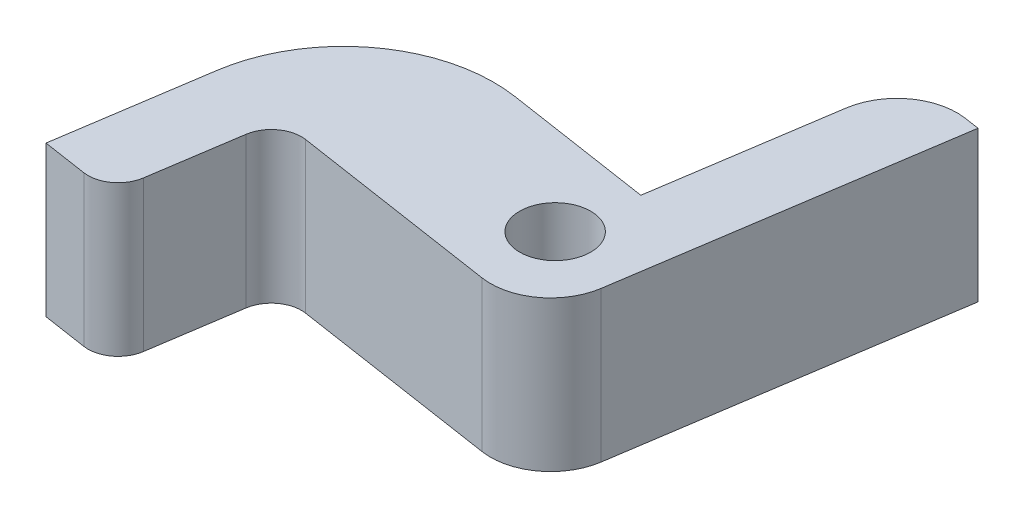
ISO-10303-21;
HEADER;
FILE_DESCRIPTION(('STEP AP214'),'2;1');
FILE_NAME('part.step','',(''),(''),'','','');
FILE_SCHEMA(('AUTOMOTIVE_DESIGN { 1 0 10303 214 1 1 1 1 }'));
ENDSEC;
DATA;
#1=APPLICATION_CONTEXT('core data for automotive mechanical design processes');
#2=APPLICATION_PROTOCOL_DEFINITION('international standard','automotive_design',2000,#1);
#3=PRODUCT_CONTEXT('',#1,'mechanical');
#4=PRODUCT('Part','Part','',(#3));
#5=PRODUCT_RELATED_PRODUCT_CATEGORY('part','',(#4));
#6=PRODUCT_DEFINITION_FORMATION('','',#4);
#7=PRODUCT_DEFINITION_CONTEXT('part definition',#1,'design');
#8=PRODUCT_DEFINITION('design','',#6,#7);
#9=PRODUCT_DEFINITION_SHAPE('','',#8);
#10=(LENGTH_UNIT() NAMED_UNIT(*) SI_UNIT(.MILLI.,.METRE.));
#11=(NAMED_UNIT(*) PLANE_ANGLE_UNIT() SI_UNIT($,.RADIAN.));
#12=(NAMED_UNIT(*) SI_UNIT($,.STERADIAN.) SOLID_ANGLE_UNIT());
#13=UNCERTAINTY_MEASURE_WITH_UNIT(LENGTH_MEASURE(1.E-05),#10,'distance_accuracy_value','');
#14=(GEOMETRIC_REPRESENTATION_CONTEXT(3) GLOBAL_UNCERTAINTY_ASSIGNED_CONTEXT((#13)) GLOBAL_UNIT_ASSIGNED_CONTEXT((#10,
#11,#12)) REPRESENTATION_CONTEXT('',''));
#15=CARTESIAN_POINT('',(0.,0.,0.));
#16=DIRECTION('',(0.,0.,1.));
#17=DIRECTION('',(1.,0.,0.));
#18=AXIS2_PLACEMENT_3D('',#15,#16,#17);
#19=CARTESIAN_POINT('',(-11.3381546003445,6.35,74.5803320191298));
#20=DIRECTION('',(-0.150299137599041,0.,0.988640566250943));
#21=DIRECTION('',(0.988640566250943,0.,0.150299137599041));
#22=AXIS2_PLACEMENT_3D('',#19,#20,#21);
#23=PLANE('',#22);
#24=DIRECTION('',(-0.988640566250943,0.,-0.150299137599041));
#25=VECTOR('',#24,1.);
#26=CARTESIAN_POINT('',(-11.3381546003445,0.,74.5803320191298));
#27=LINE('',#26,#25);
#28=CARTESIAN_POINT('',(9.67558699431014,0.,77.774968520222));
#29=VERTEX_POINT('',#28);
#30=CARTESIAN_POINT('',(0.886572360338652,0.,76.4388091869664));
#31=VERTEX_POINT('',#30);
#32=EDGE_CURVE('E179',#29,#31,#27,.T.);
#33=ORIENTED_EDGE('',*,*,#32,.F.);
#34=DIRECTION('',(0.,-1.,0.));
#35=VECTOR('',#34,1.);
#36=CARTESIAN_POINT('',(9.67558699431014,6.35,77.774968520222));
#37=LINE('',#36,#35);
#38=CARTESIAN_POINT('',(9.67558699431014,6.35,77.774968520222));
#39=VERTEX_POINT('',#38);
#40=EDGE_CURVE('E47',#29,#39,#37,.F.);
#41=ORIENTED_EDGE('',*,*,#40,.T.);
#42=DIRECTION('',(-0.988640566250943,0.,-0.150299137599041));
#43=VECTOR('',#42,1.);
#44=CARTESIAN_POINT('',(-11.3381546003445,6.35,74.5803320191298));
#45=LINE('',#44,#43);
#46=CARTESIAN_POINT('',(0.886572360338652,6.35,76.4388091869664));
#47=VERTEX_POINT('',#46);
#48=EDGE_CURVE('E158',#39,#47,#45,.T.);
#49=ORIENTED_EDGE('',*,*,#48,.T.);
#50=DIRECTION('',(0.,-1.,0.));
#51=VECTOR('',#50,1.);
#52=CARTESIAN_POINT('',(0.886572360338654,0.,76.4388091869664));
#53=LINE('',#52,#51);
#54=EDGE_CURVE('E213',#47,#31,#53,.T.);
#55=ORIENTED_EDGE('',*,*,#54,.T.);
#56=EDGE_LOOP('',(#33,#41,#49,#55));
#57=FACE_BOUND('',#56,.T.);
#58=ADVANCED_FACE('F39',(#57),#23,.T.);
#59=CARTESIAN_POINT('',(23.5248886329319,6.35,3.57639631059365));
#60=DIRECTION('',(0.988640566250943,0.,0.150299137599038));
#61=DIRECTION('',(0.150299137599038,0.,-0.988640566250943));
#62=AXIS2_PLACEMENT_3D('',#59,#60,#61);
#63=PLANE('',#62);
#64=DIRECTION('',(-0.150299137599038,0.,0.988640566250943));
#65=VECTOR('',#64,1.);
#66=CARTESIAN_POINT('',(23.5248886329319,6.35,3.57639631059365));
#67=LINE('',#66,#65);
#68=CARTESIAN_POINT('',(14.6681727943476,6.35,61.8342725809207));
#69=VERTEX_POINT('',#68);
#70=CARTESIAN_POINT('',(12.5684938420891,6.35,75.6455812914462));
#71=VERTEX_POINT('',#70);
#72=EDGE_CURVE('E137',#69,#71,#67,.T.);
#73=ORIENTED_EDGE('',*,*,#72,.T.);
#74=DIRECTION('',(0.,-1.,0.));
#75=VECTOR('',#74,1.);
#76=CARTESIAN_POINT('',(12.5684938420891,6.35,75.6455812914462));
#77=LINE('',#76,#75);
#78=CARTESIAN_POINT('',(12.5684938420891,0.,75.6455812914462));
#79=VERTEX_POINT('',#78);
#80=EDGE_CURVE('E238',#71,#79,#77,.T.);
#81=ORIENTED_EDGE('',*,*,#80,.T.);
#82=DIRECTION('',(-0.150299137599038,0.,0.988640566250943));
#83=VECTOR('',#82,1.);
#84=CARTESIAN_POINT('',(23.5248886329319,0.,3.57639631059365));
#85=LINE('',#84,#83);
#86=CARTESIAN_POINT('',(14.6681727943476,0.,61.8342725809207));
#87=VERTEX_POINT('',#86);
#88=EDGE_CURVE('E139',#87,#79,#85,.T.);
#89=ORIENTED_EDGE('',*,*,#88,.F.);
#90=DIRECTION('',(0.,-1.,0.));
#91=VECTOR('',#90,1.);
#92=CARTESIAN_POINT('',(14.6681727943476,6.35,61.8342725809207));
#93=LINE('',#92,#91);
#94=EDGE_CURVE('E132',#69,#87,#93,.T.);
#95=ORIENTED_EDGE('',*,*,#94,.F.);
#96=EDGE_LOOP('',(#73,#81,#89,#95));
#97=FACE_BOUND('',#96,.T.);
#98=ADVANCED_FACE('F134',(#97),#63,.T.);
#99=CARTESIAN_POINT('',(-8.85671583858425,6.35,58.2578762703271));
#100=DIRECTION('',(-0.150299137599038,0.,0.988640566250943));
#101=DIRECTION('',(0.988640566250943,0.,0.150299137599038));
#102=AXIS2_PLACEMENT_3D('',#99,#100,#101);
#103=PLANE('',#102);
#104=DIRECTION('',(-0.988640566250943,0.,-0.150299137599038));
#105=VECTOR('',#104,1.);
#106=CARTESIAN_POINT('',(-8.85671583858425,0.,58.2578762703271));
#107=LINE('',#106,#105);
#108=CARTESIAN_POINT('',(14.0403860347784,0.,61.7388326285454));
#109=VERTEX_POINT('',#108);
#110=EDGE_CURVE('E182',#87,#109,#107,.T.);
#111=ORIENTED_EDGE('',*,*,#110,.T.);
#112=DIRECTION('',(0.,-1.,0.));
#113=VECTOR('',#112,1.);
#114=CARTESIAN_POINT('',(14.0403860347784,6.35,61.7388326285454));
#115=LINE('',#114,#113);
#116=CARTESIAN_POINT('',(14.0403860347784,6.35,61.7388326285454));
#117=VERTEX_POINT('',#116);
#118=EDGE_CURVE('E150',#109,#117,#115,.F.);
#119=ORIENTED_EDGE('',*,*,#118,.T.);
#120=DIRECTION('',(-0.988640566250943,0.,-0.150299137599038));
#121=VECTOR('',#120,1.);
#122=CARTESIAN_POINT('',(-8.85671583858425,6.35,58.2578762703271));
#123=LINE('',#122,#121);
#124=EDGE_CURVE('E147',#69,#117,#123,.T.);
#125=ORIENTED_EDGE('',*,*,#124,.F.);
#126=ORIENTED_EDGE('',*,*,#94,.T.);
#127=EDGE_LOOP('',(#111,#119,#125,#126));
#128=FACE_BOUND('',#127,.T.);
#129=ADVANCED_FACE('F148',(#128),#103,.F.);
#130=CARTESIAN_POINT('',(20.3859548350853,6.35,3.09919654871673));
#131=DIRECTION('',(0.988640566250943,0.,0.150299137599039));
#132=DIRECTION('',(0.150299137599039,0.,-0.988640566250943));
#133=AXIS2_PLACEMENT_3D('',#130,#131,#132);
#134=PLANE('',#133);
#135=DIRECTION('',(-0.150299137599039,0.,0.988640566250943));
#136=VECTOR('',#135,1.);
#137=CARTESIAN_POINT('',(20.3859548350853,6.35,3.09919654871673));
#138=LINE('',#137,#136);
#139=CARTESIAN_POINT('',(11.1474791869995,6.35,63.8682198573212));
#140=VERTEX_POINT('',#139);
#141=CARTESIAN_POINT('',(10.0021997584948,6.35,71.4016609721534));
#142=VERTEX_POINT('',#141);
#143=EDGE_CURVE('E153',#140,#142,#138,.T.);
#144=ORIENTED_EDGE('',*,*,#143,.F.);
#145=DIRECTION('',(0.,-1.,0.));
#146=VECTOR('',#145,1.);
#147=CARTESIAN_POINT('',(11.1474791869995,6.35,63.8682198573212));
#148=LINE('',#147,#146);
#149=CARTESIAN_POINT('',(11.1474791869995,0.,63.8682198573212));
#150=VERTEX_POINT('',#149);
#151=EDGE_CURVE('E221',#140,#150,#148,.T.);
#152=ORIENTED_EDGE('',*,*,#151,.T.);
#153=DIRECTION('',(-0.150299137599039,0.,0.988640566250943));
#154=VECTOR('',#153,1.);
#155=CARTESIAN_POINT('',(20.3859548350853,0.,3.09919654871673));
#156=LINE('',#155,#154);
#157=CARTESIAN_POINT('',(10.0021997584948,0.,71.4016609721534));
#158=VERTEX_POINT('',#157);
#159=EDGE_CURVE('E184',#150,#158,#156,.T.);
#160=ORIENTED_EDGE('',*,*,#159,.T.);
#161=DIRECTION('',(0.,-1.,0.));
#162=VECTOR('',#161,1.);
#163=CARTESIAN_POINT('',(10.0021997584948,6.35,71.4016609721534));
#164=LINE('',#163,#162);
#165=EDGE_CURVE('E144',#142,#158,#164,.T.);
#166=ORIENTED_EDGE('',*,*,#165,.F.);
#167=EDGE_LOOP('',(#144,#152,#160,#166));
#168=FACE_BOUND('',#167,.T.);
#169=ADVANCED_FACE('F251',(#168),#134,.F.);
#170=CARTESIAN_POINT('',(-10.3837550765905,6.35,68.3024644234367));
#171=DIRECTION('',(0.150299137599039,0.,-0.988640566250943));
#172=DIRECTION('',(-0.988640566250943,0.,-0.150299137599039));
#173=AXIS2_PLACEMENT_3D('',#170,#171,#172);
#174=PLANE('',#173);
#175=DIRECTION('',(0.988640566250943,0.,0.150299137599039));
#176=VECTOR('',#175,1.);
#177=CARTESIAN_POINT('',(-10.3837550765905,0.,68.3024644234367));
#178=LINE('',#177,#176);
#179=CARTESIAN_POINT('',(3.72433216280042,0.,70.4472614483993));
#180=VERTEX_POINT('',#179);
#181=EDGE_CURVE('E187',#180,#158,#178,.T.);
#182=ORIENTED_EDGE('',*,*,#181,.F.);
#183=DIRECTION('',(0.,-1.,0.));
#184=VECTOR('',#183,1.);
#185=CARTESIAN_POINT('',(3.72433216280042,6.35,70.4472614483993));
#186=LINE('',#185,#184);
#187=CARTESIAN_POINT('',(3.72433216280042,6.35,70.4472614483993));
#188=VERTEX_POINT('',#187);
#189=EDGE_CURVE('E234',#180,#188,#186,.F.);
#190=ORIENTED_EDGE('',*,*,#189,.T.);
#191=DIRECTION('',(0.988640566250943,0.,0.150299137599039));
#192=VECTOR('',#191,1.);
#193=CARTESIAN_POINT('',(-10.3837550765905,6.35,68.3024644234367));
#194=LINE('',#193,#192);
#195=EDGE_CURVE('E165',#188,#142,#194,.T.);
#196=ORIENTED_EDGE('',*,*,#195,.T.);
#197=ORIENTED_EDGE('',*,*,#165,.T.);
#198=EDGE_LOOP('',(#182,#190,#196,#197));
#199=FACE_BOUND('',#198,.T.);
#200=ADVANCED_FACE('F254',(#199),#174,.T.);
#201=CARTESIAN_POINT('',(7.83021964369742,6.35,1.19039750120879));
#202=DIRECTION('',(-0.988640566250943,0.,-0.150299137599038));
#203=DIRECTION('',(-0.150299137599038,0.,0.988640566250943));
#204=AXIS2_PLACEMENT_3D('',#201,#202,#203);
#205=PLANE('',#204);
#206=DIRECTION('',(0.150299137599038,0.,-0.988640566250943));
#207=VECTOR('',#206,1.);
#208=CARTESIAN_POINT('',(7.83021964369742,6.35,1.19039750120879));
#209=LINE('',#208,#207);
#210=CARTESIAN_POINT('',(-4.46233448040086,6.35,82.0485971160324));
#211=VERTEX_POINT('',#210);
#212=CARTESIAN_POINT('',(-3.50793495664697,6.35,75.770729520339));
#213=VERTEX_POINT('',#212);
#214=EDGE_CURVE('E167',#211,#213,#209,.T.);
#215=ORIENTED_EDGE('',*,*,#214,.T.);
#216=DIRECTION('',(0.,-1.,0.));
#217=VECTOR('',#216,1.);
#218=CARTESIAN_POINT('',(-3.50793495664697,6.35,75.7707295203389));
#219=LINE('',#218,#217);
#220=CARTESIAN_POINT('',(-3.50793495664697,0.,75.770729520339));
#221=VERTEX_POINT('',#220);
#222=EDGE_CURVE('E229',#213,#221,#219,.T.);
#223=ORIENTED_EDGE('',*,*,#222,.T.);
#224=DIRECTION('',(0.150299137599038,0.,-0.988640566250943));
#225=VECTOR('',#224,1.);
#226=CARTESIAN_POINT('',(7.83021964369742,0.,1.19039750120879));
#227=LINE('',#226,#225);
#228=CARTESIAN_POINT('',(-4.46233448040086,0.,82.0485971160324));
#229=VERTEX_POINT('',#228);
#230=EDGE_CURVE('E189',#229,#221,#227,.T.);
#231=ORIENTED_EDGE('',*,*,#230,.F.);
#232=DIRECTION('',(0.,-1.,0.));
#233=VECTOR('',#232,1.);
#234=CARTESIAN_POINT('',(-4.46233448040086,6.35,82.0485971160324));
#235=LINE('',#234,#233);
#236=EDGE_CURVE('E178',#211,#229,#235,.T.);
#237=ORIENTED_EDGE('',*,*,#236,.F.);
#238=EDGE_LOOP('',(#215,#223,#231,#237));
#239=FACE_BOUND('',#238,.T.);
#240=ADVANCED_FACE('F263',(#239),#205,.T.);
#241=CARTESIAN_POINT('',(-12.2925541240982,6.35,80.8581996148237));
#242=DIRECTION('',(-0.150299137599037,0.,0.988640566250943));
#243=DIRECTION('',(0.988640566250943,0.,0.150299137599037));
#244=AXIS2_PLACEMENT_3D('',#241,#242,#243);
#245=PLANE('',#244);
#246=DIRECTION('',(-0.988640566250943,0.,-0.150299137599037));
#247=VECTOR('',#246,1.);
#248=CARTESIAN_POINT('',(-12.2925541240982,0.,80.8581996148237));
#249=LINE('',#248,#247);
#250=CARTESIAN_POINT('',(-2.57897420169268,0.,82.3349169731586));
#251=VERTEX_POINT('',#250);
#252=EDGE_CURVE('E192',#251,#229,#249,.T.);
#253=ORIENTED_EDGE('',*,*,#252,.F.);
#254=DIRECTION('',(0.,-1.,0.));
#255=VECTOR('',#254,1.);
#256=CARTESIAN_POINT('',(-2.57897420169268,6.35,82.3349169731586));
#257=LINE('',#256,#255);
#258=CARTESIAN_POINT('',(-2.57897420169268,6.35,82.3349169731586));
#259=VERTEX_POINT('',#258);
#260=EDGE_CURVE('E209',#251,#259,#257,.F.);
#261=ORIENTED_EDGE('',*,*,#260,.T.);
#262=DIRECTION('',(-0.988640566250943,0.,-0.150299137599037));
#263=VECTOR('',#262,1.);
#264=CARTESIAN_POINT('',(-12.2925541240982,6.35,80.8581996148237));
#265=LINE('',#264,#263);
#266=EDGE_CURVE('E170',#259,#211,#265,.T.);
#267=ORIENTED_EDGE('',*,*,#266,.T.);
#268=ORIENTED_EDGE('',*,*,#236,.T.);
#269=EDGE_LOOP('',(#253,#261,#267,#268));
#270=FACE_BOUND('',#269,.T.);
#271=ADVANCED_FACE('F268',(#270),#245,.T.);
#272=CARTESIAN_POINT('',(10.9691534415443,6.35,1.66759726308576));
#273=DIRECTION('',(0.988640566250943,0.,0.150299137599038));
#274=DIRECTION('',(0.150299137599038,0.,-0.988640566250943));
#275=AXIS2_PLACEMENT_3D('',#272,#273,#274);
#276=PLANE('',#275);
#277=DIRECTION('',(-0.150299137599038,0.,0.988640566250943));
#278=VECTOR('',#277,1.);
#279=CARTESIAN_POINT('',(10.9691534415443,6.35,1.66759726308576));
#280=LINE('',#279,#278);
#281=CARTESIAN_POINT('',(-0.559881063550829,6.35,77.5035028013544));
#282=VERTEX_POINT('',#281);
#283=CARTESIAN_POINT('',(-1.13252077780321,6.35,81.2702233587707));
#284=VERTEX_POINT('',#283);
#285=EDGE_CURVE('E172',#282,#284,#280,.T.);
#286=ORIENTED_EDGE('',*,*,#285,.T.);
#287=DIRECTION('',(0.,-1.,0.));
#288=VECTOR('',#287,1.);
#289=CARTESIAN_POINT('',(-1.13252077780321,6.35,81.2702233587707));
#290=LINE('',#289,#288);
#291=CARTESIAN_POINT('',(-1.13252077780321,0.,81.2702233587707));
#292=VERTEX_POINT('',#291);
#293=EDGE_CURVE('E204',#284,#292,#290,.T.);
#294=ORIENTED_EDGE('',*,*,#293,.T.);
#295=DIRECTION('',(-0.150299137599038,0.,0.988640566250943));
#296=VECTOR('',#295,1.);
#297=CARTESIAN_POINT('',(10.9691534415443,0.,1.66759726308576));
#298=LINE('',#297,#296);
#299=CARTESIAN_POINT('',(-0.559881063550829,0.,77.5035028013544));
#300=VERTEX_POINT('',#299);
#301=EDGE_CURVE('E194',#300,#292,#298,.T.);
#302=ORIENTED_EDGE('',*,*,#301,.F.);
#303=DIRECTION('',(0.,-1.,0.));
#304=VECTOR('',#303,1.);
#305=CARTESIAN_POINT('',(-0.559881063550825,6.35,77.5035028013543));
#306=LINE('',#305,#304);
#307=EDGE_CURVE('E143',#300,#282,#306,.F.);
#308=ORIENTED_EDGE('',*,*,#307,.T.);
#309=EDGE_LOOP('',(#286,#294,#302,#308));
#310=FACE_BOUND('',#309,.T.);
#311=ADVANCED_FACE('F277',(#310),#276,.T.);
#312=CARTESIAN_POINT('',(9.52499999661688,6.35,74.54059477));
#313=DIRECTION('',(0.,-1.,0.));
#314=DIRECTION('',(0.,0.,-1.));
#315=AXIS2_PLACEMENT_3D('',#312,#313,#314);
#316=CYLINDRICAL_SURFACE('',#315,1.50000000000001);
#317=CARTESIAN_POINT('',(9.52499999661688,6.35,74.54059477));
#318=DIRECTION('',(0.,1.,0.));
#319=DIRECTION('',(0.,0.,1.));
#320=AXIS2_PLACEMENT_3D('',#317,#318,#319);
#321=CIRCLE('',#320,1.50000000000001);
#322=CARTESIAN_POINT('',(9.52499999661688,6.35,76.04059477));
#323=VERTEX_POINT('',#322);
#324=EDGE_CURVE('E175',#323,#323,#321,.T.);
#325=ORIENTED_EDGE('',*,*,#324,.T.);
#326=EDGE_LOOP('',(#325));
#327=FACE_BOUND('',#326,.T.);
#328=CARTESIAN_POINT('',(9.52499999661688,0.,74.54059477));
#329=DIRECTION('',(0.,1.,0.));
#330=DIRECTION('',(0.,0.,1.));
#331=AXIS2_PLACEMENT_3D('',#328,#329,#330);
#332=CIRCLE('',#331,1.50000000000001);
#333=CARTESIAN_POINT('',(9.52499999661688,0.,76.04059477));
#334=VERTEX_POINT('',#333);
#335=EDGE_CURVE('E160',#334,#334,#332,.T.);
#336=ORIENTED_EDGE('',*,*,#335,.F.);
#337=EDGE_LOOP('',(#336));
#338=FACE_BOUND('',#337,.T.);
#339=ADVANCED_FACE('F338',(#327,#338),#316,.F.);
#340=CARTESIAN_POINT('',(0.,6.35,0.));
#341=DIRECTION('',(0.,1.,0.));
#342=DIRECTION('',(0.,0.,1.));
#343=AXIS2_PLACEMENT_3D('',#340,#341,#342);
#344=PLANE('',#343);
#345=ORIENTED_EDGE('',*,*,#48,.F.);
#346=CARTESIAN_POINT('',(10.0573468038117,6.35,75.2638214819446));
#347=DIRECTION('',(0.,1.,0.));
#348=DIRECTION('',(0.,0.,1.));
#349=AXIS2_PLACEMENT_3D('',#346,#347,#348);
#350=CIRCLE('',#349,2.54);
#351=EDGE_CURVE('E11',#39,#71,#350,.T.);
#352=ORIENTED_EDGE('',*,*,#351,.T.);
#353=ORIENTED_EDGE('',*,*,#72,.F.);
#354=ORIENTED_EDGE('',*,*,#124,.T.);
#355=CARTESIAN_POINT('',(13.6586262252768,6.35,64.2499796668228));
#356=DIRECTION('',(0.,1.,0.));
#357=DIRECTION('',(0.,0.,1.));
#358=AXIS2_PLACEMENT_3D('',#355,#356,#357);
#359=CIRCLE('',#358,2.54);
#360=EDGE_CURVE('E227',#117,#140,#359,.T.);
#361=ORIENTED_EDGE('',*,*,#360,.T.);
#362=ORIENTED_EDGE('',*,*,#143,.T.);
#363=ORIENTED_EDGE('',*,*,#195,.F.);
#364=CARTESIAN_POINT('',(2.76993263904652,6.35,76.7251290440928));
#365=DIRECTION('',(0.,1.,0.));
#366=DIRECTION('',(0.,0.,1.));
#367=AXIS2_PLACEMENT_3D('',#364,#365,#366);
#368=CIRCLE('',#367,6.35);
#369=EDGE_CURVE('E236',#188,#213,#368,.T.);
#370=ORIENTED_EDGE('',*,*,#369,.T.);
#371=ORIENTED_EDGE('',*,*,#214,.F.);
#372=ORIENTED_EDGE('',*,*,#266,.F.);
#373=CARTESIAN_POINT('',(-2.3880942969419,6.35,81.0793434540199));
#374=DIRECTION('',(0.,1.,0.));
#375=DIRECTION('',(0.,0.,1.));
#376=AXIS2_PLACEMENT_3D('',#373,#374,#375);
#377=CIRCLE('',#376,1.27);
#378=EDGE_CURVE('E211',#259,#284,#377,.T.);
#379=ORIENTED_EDGE('',*,*,#378,.T.);
#380=ORIENTED_EDGE('',*,*,#285,.F.);
#381=CARTESIAN_POINT('',(0.695692455587873,6.35,77.6943827061051));
#382=DIRECTION('',(0.,1.,0.));
#383=DIRECTION('',(0.,0.,1.));
#384=AXIS2_PLACEMENT_3D('',#381,#382,#383);
#385=CIRCLE('',#384,1.27);
#386=EDGE_CURVE('E218',#282,#47,#385,.F.);
#387=ORIENTED_EDGE('',*,*,#386,.T.);
#388=EDGE_LOOP('',(#345,#352,#353,#354,#361,#362,#363,#370,#371,#372,#379,#380,#387));
#389=FACE_BOUND('',#388,.T.);
#390=ORIENTED_EDGE('',*,*,#324,.F.);
#391=EDGE_LOOP('',(#390));
#392=FACE_BOUND('',#391,.T.);
#393=ADVANCED_FACE('F155',(#389,#392),#344,.T.);
#394=CARTESIAN_POINT('',(0.,0.,0.));
#395=DIRECTION('',(0.,1.,0.));
#396=DIRECTION('',(0.,0.,1.));
#397=AXIS2_PLACEMENT_3D('',#394,#395,#396);
#398=PLANE('',#397);
#399=ORIENTED_EDGE('',*,*,#88,.T.);
#400=CARTESIAN_POINT('',(10.0573468038117,0.,75.2638214819446));
#401=DIRECTION('',(0.,1.,0.));
#402=DIRECTION('',(0.,0.,1.));
#403=AXIS2_PLACEMENT_3D('',#400,#401,#402);
#404=CIRCLE('',#403,2.54);
#405=EDGE_CURVE('E61',#79,#29,#404,.F.);
#406=ORIENTED_EDGE('',*,*,#405,.T.);
#407=ORIENTED_EDGE('',*,*,#32,.T.);
#408=CARTESIAN_POINT('',(0.695692455587873,0.,77.6943827061051));
#409=DIRECTION('',(0.,1.,0.));
#410=DIRECTION('',(0.,0.,1.));
#411=AXIS2_PLACEMENT_3D('',#408,#409,#410);
#412=CIRCLE('',#411,1.27);
#413=EDGE_CURVE('E216',#31,#300,#412,.T.);
#414=ORIENTED_EDGE('',*,*,#413,.T.);
#415=ORIENTED_EDGE('',*,*,#301,.T.);
#416=CARTESIAN_POINT('',(-2.3880942969419,0.,81.0793434540199));
#417=DIRECTION('',(0.,1.,0.));
#418=DIRECTION('',(0.,0.,1.));
#419=AXIS2_PLACEMENT_3D('',#416,#417,#418);
#420=CIRCLE('',#419,1.27);
#421=EDGE_CURVE('E207',#292,#251,#420,.F.);
#422=ORIENTED_EDGE('',*,*,#421,.T.);
#423=ORIENTED_EDGE('',*,*,#252,.T.);
#424=ORIENTED_EDGE('',*,*,#230,.T.);
#425=CARTESIAN_POINT('',(2.76993263904652,0.,76.7251290440928));
#426=DIRECTION('',(0.,1.,0.));
#427=DIRECTION('',(0.,0.,1.));
#428=AXIS2_PLACEMENT_3D('',#425,#426,#427);
#429=CIRCLE('',#428,6.35);
#430=EDGE_CURVE('E232',#221,#180,#429,.F.);
#431=ORIENTED_EDGE('',*,*,#430,.T.);
#432=ORIENTED_EDGE('',*,*,#181,.T.);
#433=ORIENTED_EDGE('',*,*,#159,.F.);
#434=CARTESIAN_POINT('',(13.6586262252768,0.,64.2499796668228));
#435=DIRECTION('',(0.,1.,0.));
#436=DIRECTION('',(0.,0.,1.));
#437=AXIS2_PLACEMENT_3D('',#434,#435,#436);
#438=CIRCLE('',#437,2.54);
#439=EDGE_CURVE('E224',#150,#109,#438,.F.);
#440=ORIENTED_EDGE('',*,*,#439,.T.);
#441=ORIENTED_EDGE('',*,*,#110,.F.);
#442=EDGE_LOOP('',(#399,#406,#407,#414,#415,#422,#423,#424,#431,#432,#433,#440,#441));
#443=FACE_BOUND('',#442,.T.);
#444=ORIENTED_EDGE('',*,*,#335,.T.);
#445=EDGE_LOOP('',(#444));
#446=FACE_BOUND('',#445,.T.);
#447=ADVANCED_FACE('F241',(#443,#446),#398,.F.);
#448=CARTESIAN_POINT('',(-2.3880942969419,6.35,81.0793434540199));
#449=DIRECTION('',(0.,-1.,0.));
#450=DIRECTION('',(0.,0.,-1.));
#451=AXIS2_PLACEMENT_3D('',#448,#449,#450);
#452=CYLINDRICAL_SURFACE('',#451,1.27);
#453=ORIENTED_EDGE('',*,*,#378,.F.);
#454=ORIENTED_EDGE('',*,*,#260,.F.);
#455=ORIENTED_EDGE('',*,*,#421,.F.);
#456=ORIENTED_EDGE('',*,*,#293,.F.);
#457=EDGE_LOOP('',(#453,#454,#455,#456));
#458=FACE_BOUND('',#457,.T.);
#459=ADVANCED_FACE('F274',(#458),#452,.T.);
#460=CARTESIAN_POINT('',(0.695692455587873,6.35,77.6943827061051));
#461=DIRECTION('',(0.,1.,0.));
#462=DIRECTION('',(0.,0.,1.));
#463=AXIS2_PLACEMENT_3D('',#460,#461,#462);
#464=CYLINDRICAL_SURFACE('',#463,1.27);
#465=ORIENTED_EDGE('',*,*,#386,.F.);
#466=ORIENTED_EDGE('',*,*,#307,.F.);
#467=ORIENTED_EDGE('',*,*,#413,.F.);
#468=ORIENTED_EDGE('',*,*,#54,.F.);
#469=EDGE_LOOP('',(#465,#466,#467,#468));
#470=FACE_BOUND('',#469,.T.);
#471=ADVANCED_FACE('F283',(#470),#464,.F.);
#472=CARTESIAN_POINT('',(13.6586262252768,6.35,64.2499796668228));
#473=DIRECTION('',(0.,-1.,0.));
#474=DIRECTION('',(0.,0.,-1.));
#475=AXIS2_PLACEMENT_3D('',#472,#473,#474);
#476=CYLINDRICAL_SURFACE('',#475,2.54);
#477=ORIENTED_EDGE('',*,*,#360,.F.);
#478=ORIENTED_EDGE('',*,*,#118,.F.);
#479=ORIENTED_EDGE('',*,*,#439,.F.);
#480=ORIENTED_EDGE('',*,*,#151,.F.);
#481=EDGE_LOOP('',(#477,#478,#479,#480));
#482=FACE_BOUND('',#481,.T.);
#483=ADVANCED_FACE('F245',(#482),#476,.T.);
#484=CARTESIAN_POINT('',(2.76993263904652,6.35,76.7251290440928));
#485=DIRECTION('',(0.,-1.,0.));
#486=DIRECTION('',(0.,0.,-1.));
#487=AXIS2_PLACEMENT_3D('',#484,#485,#486);
#488=CYLINDRICAL_SURFACE('',#487,6.35);
#489=ORIENTED_EDGE('',*,*,#369,.F.);
#490=ORIENTED_EDGE('',*,*,#189,.F.);
#491=ORIENTED_EDGE('',*,*,#430,.F.);
#492=ORIENTED_EDGE('',*,*,#222,.F.);
#493=EDGE_LOOP('',(#489,#490,#491,#492));
#494=FACE_BOUND('',#493,.T.);
#495=ADVANCED_FACE('F260',(#494),#488,.T.);
#496=CARTESIAN_POINT('',(10.0573468038117,6.35,75.2638214819446));
#497=DIRECTION('',(0.,-1.,0.));
#498=DIRECTION('',(0.,0.,-1.));
#499=AXIS2_PLACEMENT_3D('',#496,#497,#498);
#500=CYLINDRICAL_SURFACE('',#499,2.54);
#501=ORIENTED_EDGE('',*,*,#351,.F.);
#502=ORIENTED_EDGE('',*,*,#40,.F.);
#503=ORIENTED_EDGE('',*,*,#405,.F.);
#504=ORIENTED_EDGE('',*,*,#80,.F.);
#505=EDGE_LOOP('',(#501,#502,#503,#504));
#506=FACE_BOUND('',#505,.T.);
#507=ADVANCED_FACE('F41',(#506),#500,.T.);
#508=CLOSED_SHELL('',(#58,#98,#129,#169,#200,#240,#271,#311,#339,#393,#447,#459,#471,#483,#495,#507));
#509=MANIFOLD_SOLID_BREP('B2',#508);
#510=ADVANCED_BREP_SHAPE_REPRESENTATION('',(#18,#509),#14);
#511=SHAPE_DEFINITION_REPRESENTATION(#9,#510);
ENDSEC;
END-ISO-10303-21;
